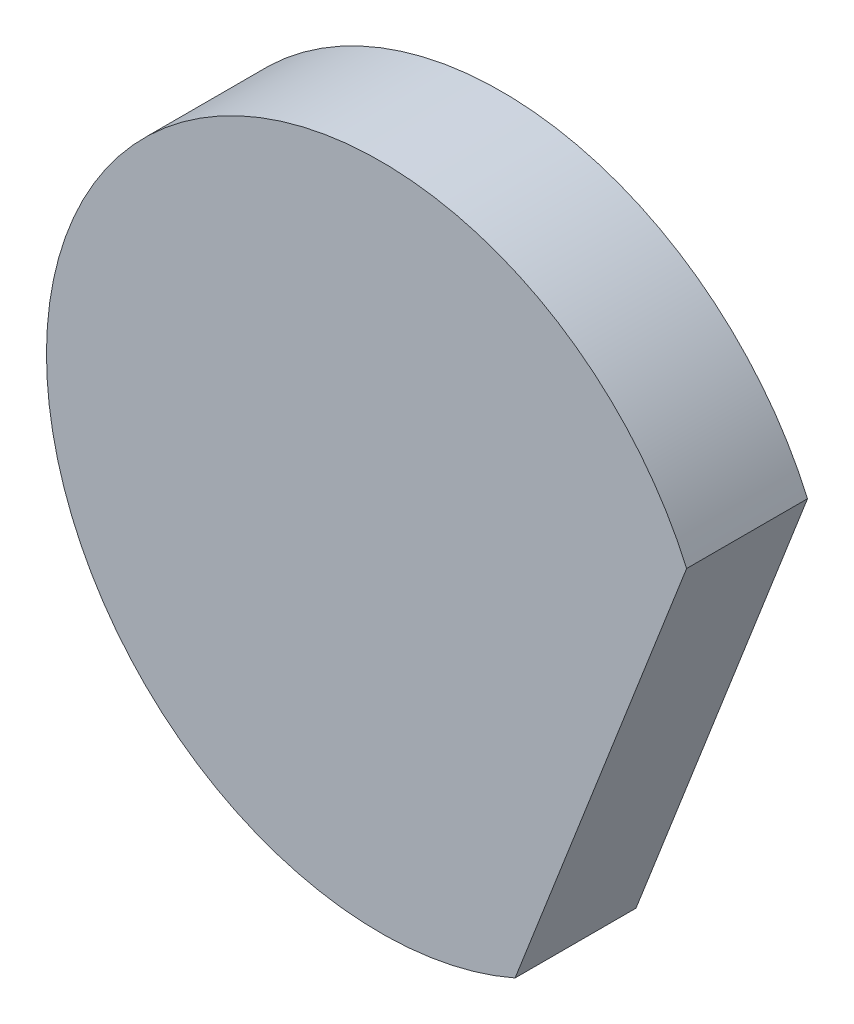
ISO-10303-21;
HEADER;
FILE_DESCRIPTION(('STEP AP214'),'2;1');
FILE_NAME('part.step','',(''),(''),'','','');
FILE_SCHEMA(('AUTOMOTIVE_DESIGN { 1 0 10303 214 1 1 1 1 }'));
ENDSEC;
DATA;
#1=APPLICATION_CONTEXT('core data for automotive mechanical design processes');
#2=APPLICATION_PROTOCOL_DEFINITION('international standard','automotive_design',2000,#1);
#3=PRODUCT_CONTEXT('',#1,'mechanical');
#4=PRODUCT('Part','Part','',(#3));
#5=PRODUCT_RELATED_PRODUCT_CATEGORY('part','',(#4));
#6=PRODUCT_DEFINITION_FORMATION('','',#4);
#7=PRODUCT_DEFINITION_CONTEXT('part definition',#1,'design');
#8=PRODUCT_DEFINITION('design','',#6,#7);
#9=PRODUCT_DEFINITION_SHAPE('','',#8);
#10=(LENGTH_UNIT() NAMED_UNIT(*) SI_UNIT(.MILLI.,.METRE.));
#11=(NAMED_UNIT(*) PLANE_ANGLE_UNIT() SI_UNIT($,.RADIAN.));
#12=(NAMED_UNIT(*) SI_UNIT($,.STERADIAN.) SOLID_ANGLE_UNIT());
#13=UNCERTAINTY_MEASURE_WITH_UNIT(LENGTH_MEASURE(1.E-05),#10,'distance_accuracy_value','');
#14=(GEOMETRIC_REPRESENTATION_CONTEXT(3) GLOBAL_UNCERTAINTY_ASSIGNED_CONTEXT((#13)) GLOBAL_UNIT_ASSIGNED_CONTEXT((#10,
#11,#12)) REPRESENTATION_CONTEXT('',''));
#15=CARTESIAN_POINT('',(0.,0.,0.));
#16=DIRECTION('',(0.,0.,1.));
#17=DIRECTION('',(1.,0.,0.));
#18=AXIS2_PLACEMENT_3D('',#15,#16,#17);
#19=CARTESIAN_POINT('',(-5.137,13.719,7.139));
#20=DIRECTION('',(0.,0.,-1.));
#21=DIRECTION('',(-1.,0.,0.));
#22=AXIS2_PLACEMENT_3D('',#19,#20,#21);
#23=CYLINDRICAL_SURFACE('',#22,19.731);
#24=CARTESIAN_POINT('',(-5.137,13.719,0.));
#25=DIRECTION('',(0.,0.,1.));
#26=DIRECTION('',(1.,0.,0.));
#27=AXIS2_PLACEMENT_3D('',#24,#25,#26);
#28=CIRCLE('',#27,19.731);
#29=CARTESIAN_POINT('',(12.9273076725018,21.6558223687564,0.));
#30=VERTEX_POINT('',#29);
#31=CARTESIAN_POINT('',(2.79982236875638,-4.34530767250183,0.));
#32=VERTEX_POINT('',#31);
#33=EDGE_CURVE('E74',#30,#32,#28,.T.);
#34=ORIENTED_EDGE('',*,*,#33,.T.);
#35=DIRECTION('',(0.,0.,-1.));
#36=VECTOR('',#35,1.);
#37=CARTESIAN_POINT('',(2.79982236875638,-4.34530767250183,7.139));
#38=LINE('',#37,#36);
#39=CARTESIAN_POINT('',(2.79982236875638,-4.34530767250183,7.139));
#40=VERTEX_POINT('',#39);
#41=EDGE_CURVE('E11',#40,#32,#38,.T.);
#42=ORIENTED_EDGE('',*,*,#41,.F.);
#43=CARTESIAN_POINT('',(-5.137,13.719,7.139));
#44=DIRECTION('',(0.,0.,1.));
#45=DIRECTION('',(1.,0.,0.));
#46=AXIS2_PLACEMENT_3D('',#43,#44,#45);
#47=CIRCLE('',#46,19.731);
#48=CARTESIAN_POINT('',(12.9273076725018,21.6558223687564,7.139));
#49=VERTEX_POINT('',#48);
#50=EDGE_CURVE('E72',#49,#40,#47,.T.);
#51=ORIENTED_EDGE('',*,*,#50,.F.);
#52=DIRECTION('',(0.,0.,-1.));
#53=VECTOR('',#52,1.);
#54=CARTESIAN_POINT('',(12.9273076725018,21.6558223687564,7.139));
#55=LINE('',#54,#53);
#56=EDGE_CURVE('E47',#49,#30,#55,.T.);
#57=ORIENTED_EDGE('',*,*,#56,.T.);
#58=EDGE_LOOP('',(#34,#42,#51,#57));
#59=FACE_BOUND('',#58,.T.);
#60=ADVANCED_FACE('F41',(#59),#23,.T.);
#61=CARTESIAN_POINT('',(2.79982236875638,-4.34530767250183,7.139));
#62=DIRECTION('',(-0.931811635025439,0.362942249994704,0.));
#63=DIRECTION('',(-0.362942249994704,-0.931811635025439,0.));
#64=AXIS2_PLACEMENT_3D('',#61,#62,#63);
#65=PLANE('',#64);
#66=DIRECTION('',(0.362942249994704,0.931811635025439,0.));
#67=VECTOR('',#66,1.);
#68=CARTESIAN_POINT('',(2.79982236875638,-4.34530767250183,0.));
#69=LINE('',#68,#67);
#70=EDGE_CURVE('E61',#32,#30,#69,.T.);
#71=ORIENTED_EDGE('',*,*,#70,.T.);
#72=ORIENTED_EDGE('',*,*,#56,.F.);
#73=DIRECTION('',(0.362942249994704,0.931811635025439,0.));
#74=VECTOR('',#73,1.);
#75=CARTESIAN_POINT('',(2.79982236875638,-4.34530767250183,7.139));
#76=LINE('',#75,#74);
#77=EDGE_CURVE('E57',#40,#49,#76,.T.);
#78=ORIENTED_EDGE('',*,*,#77,.F.);
#79=ORIENTED_EDGE('',*,*,#41,.T.);
#80=EDGE_LOOP('',(#71,#72,#78,#79));
#81=FACE_BOUND('',#80,.T.);
#82=ADVANCED_FACE('F70',(#81),#65,.F.);
#83=CARTESIAN_POINT('',(-5.137,13.719,7.139));
#84=DIRECTION('',(0.,0.,1.));
#85=DIRECTION('',(1.,0.,0.));
#86=AXIS2_PLACEMENT_3D('',#83,#84,#85);
#87=PLANE('',#86);
#88=ORIENTED_EDGE('',*,*,#50,.T.);
#89=ORIENTED_EDGE('',*,*,#77,.T.);
#90=EDGE_LOOP('',(#88,#89));
#91=FACE_BOUND('',#90,.T.);
#92=ADVANCED_FACE('F80',(#91),#87,.T.);
#93=CARTESIAN_POINT('',(-5.137,13.719,0.));
#94=DIRECTION('',(0.,0.,1.));
#95=DIRECTION('',(1.,0.,0.));
#96=AXIS2_PLACEMENT_3D('',#93,#94,#95);
#97=PLANE('',#96);
#98=ORIENTED_EDGE('',*,*,#33,.F.);
#99=ORIENTED_EDGE('',*,*,#70,.F.);
#100=EDGE_LOOP('',(#98,#99));
#101=FACE_BOUND('',#100,.T.);
#102=ADVANCED_FACE('F73',(#101),#97,.F.);
#103=CLOSED_SHELL('',(#60,#82,#92,#102));
#104=MANIFOLD_SOLID_BREP('B2',#103);
#105=ADVANCED_BREP_SHAPE_REPRESENTATION('',(#18,#104),#14);
#106=SHAPE_DEFINITION_REPRESENTATION(#9,#105);
ENDSEC;
END-ISO-10303-21;
